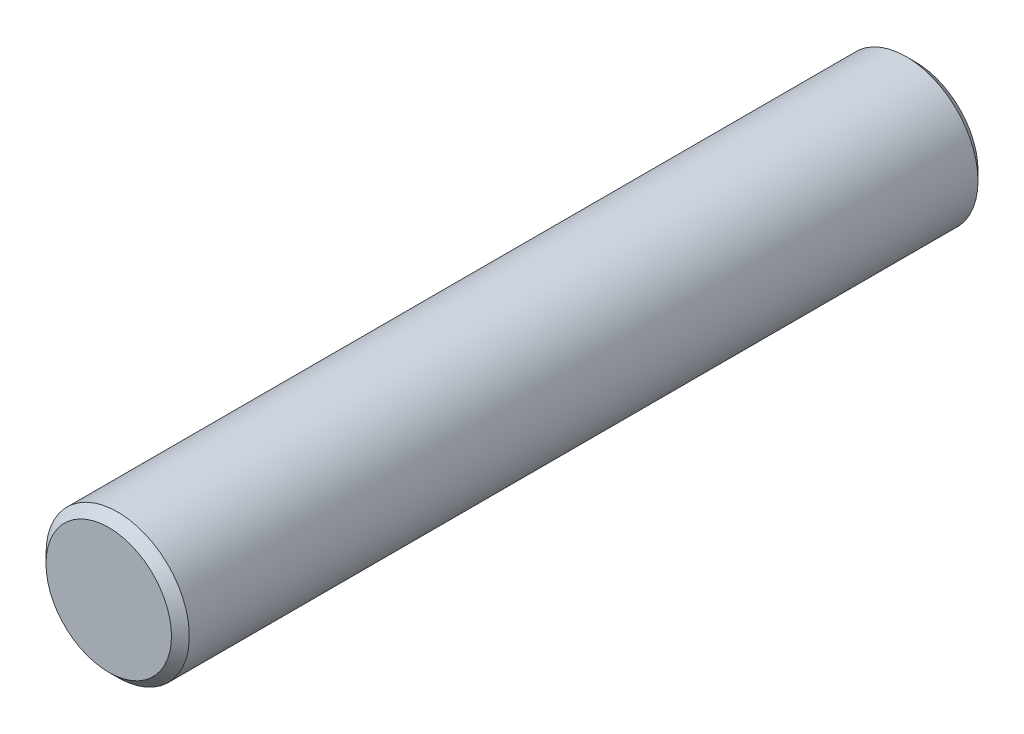
ISO-10303-21;
HEADER;
FILE_DESCRIPTION(('STEP AP214'),'2;1');
FILE_NAME('part.step','',(''),(''),'','','');
FILE_SCHEMA(('AUTOMOTIVE_DESIGN { 1 0 10303 214 1 1 1 1 }'));
ENDSEC;
DATA;
#1=APPLICATION_CONTEXT('core data for automotive mechanical design processes');
#2=APPLICATION_PROTOCOL_DEFINITION('international standard','automotive_design',2000,#1);
#3=PRODUCT_CONTEXT('',#1,'mechanical');
#4=PRODUCT('Part','Part','',(#3));
#5=PRODUCT_RELATED_PRODUCT_CATEGORY('part','',(#4));
#6=PRODUCT_DEFINITION_FORMATION('','',#4);
#7=PRODUCT_DEFINITION_CONTEXT('part definition',#1,'design');
#8=PRODUCT_DEFINITION('design','',#6,#7);
#9=PRODUCT_DEFINITION_SHAPE('','',#8);
#10=(LENGTH_UNIT() NAMED_UNIT(*) SI_UNIT(.MILLI.,.METRE.));
#11=(NAMED_UNIT(*) PLANE_ANGLE_UNIT() SI_UNIT($,.RADIAN.));
#12=(NAMED_UNIT(*) SI_UNIT($,.STERADIAN.) SOLID_ANGLE_UNIT());
#13=UNCERTAINTY_MEASURE_WITH_UNIT(LENGTH_MEASURE(1.E-05),#10,'distance_accuracy_value','');
#14=(GEOMETRIC_REPRESENTATION_CONTEXT(3) GLOBAL_UNCERTAINTY_ASSIGNED_CONTEXT((#13)) GLOBAL_UNIT_ASSIGNED_CONTEXT((#10,
#11,#12)) REPRESENTATION_CONTEXT('',''));
#15=CARTESIAN_POINT('',(0.,0.,0.));
#16=DIRECTION('',(0.,0.,1.));
#17=DIRECTION('',(1.,0.,0.));
#18=AXIS2_PLACEMENT_3D('',#15,#16,#17);
#19=CARTESIAN_POINT('',(0.,0.,45.));
#20=DIRECTION('',(0.,0.,-1.));
#21=DIRECTION('',(-1.,0.,0.));
#22=AXIS2_PLACEMENT_3D('',#19,#20,#21);
#23=CYLINDRICAL_SURFACE('',#22,4.);
#24=CARTESIAN_POINT('',(0.,0.,0.500000000000035));
#25=DIRECTION('',(0.,0.,1.));
#26=DIRECTION('',(1.,0.,0.));
#27=AXIS2_PLACEMENT_3D('',#24,#25,#26);
#28=CIRCLE('',#27,4.);
#29=CARTESIAN_POINT('',(-4.,0.,0.500000000000035));
#30=VERTEX_POINT('',#29);
#31=EDGE_CURVE('E45',#30,#30,#28,.T.);
#32=CARTESIAN_POINT('',(0.,0.,44.5));
#33=DIRECTION('',(0.,0.,1.));
#34=DIRECTION('',(1.,0.,0.));
#35=AXIS2_PLACEMENT_3D('',#32,#33,#34);
#36=CIRCLE('',#35,4.);
#37=CARTESIAN_POINT('',(-4.,0.,44.5));
#38=VERTEX_POINT('',#37);
#39=EDGE_CURVE('E49',#38,#38,#36,.F.);
#40=CARTESIAN_POINT('',(-4.,0.,0.500000000000035));
#41=CARTESIAN_POINT('',(-4.,0.,0.958333333333369));
#42=CARTESIAN_POINT('',(-4.,0.,1.4166666666667));
#43=CARTESIAN_POINT('',(-4.,0.,2.33333333333337));
#44=CARTESIAN_POINT('',(-4.,0.,2.7916666666667));
#45=CARTESIAN_POINT('',(-4.,0.,3.70833333333336));
#46=CARTESIAN_POINT('',(-4.,0.,4.1666666666667));
#47=CARTESIAN_POINT('',(-4.,0.,5.08333333333337));
#48=CARTESIAN_POINT('',(-4.,0.,5.5416666666667));
#49=CARTESIAN_POINT('',(-4.,0.,6.45833333333337));
#50=CARTESIAN_POINT('',(-4.,0.,6.9166666666667));
#51=CARTESIAN_POINT('',(-4.,0.,7.83333333333337));
#52=CARTESIAN_POINT('',(-4.,0.,8.2916666666667));
#53=CARTESIAN_POINT('',(-4.,0.,9.20833333333336));
#54=CARTESIAN_POINT('',(-4.,0.,9.6666666666667));
#55=CARTESIAN_POINT('',(-4.,0.,10.5833333333334));
#56=CARTESIAN_POINT('',(-4.,0.,11.0416666666667));
#57=CARTESIAN_POINT('',(-4.,0.,11.9583333333334));
#58=CARTESIAN_POINT('',(-4.,0.,12.4166666666667));
#59=CARTESIAN_POINT('',(-4.,0.,13.3333333333334));
#60=CARTESIAN_POINT('',(-4.,0.,13.7916666666667));
#61=CARTESIAN_POINT('',(-4.,0.,14.7083333333334));
#62=CARTESIAN_POINT('',(-4.,0.,15.1666666666667));
#63=CARTESIAN_POINT('',(-4.,0.,16.0833333333334));
#64=CARTESIAN_POINT('',(-4.,0.,16.5416666666667));
#65=CARTESIAN_POINT('',(-4.,0.,17.4583333333334));
#66=CARTESIAN_POINT('',(-4.,0.,17.9166666666667));
#67=CARTESIAN_POINT('',(-4.,0.,18.8333333333334));
#68=CARTESIAN_POINT('',(-4.,0.,19.2916666666667));
#69=CARTESIAN_POINT('',(-4.,0.,20.2083333333334));
#70=CARTESIAN_POINT('',(-4.,0.,20.6666666666667));
#71=CARTESIAN_POINT('',(-4.,0.,21.5833333333334));
#72=CARTESIAN_POINT('',(-4.,0.,22.0416666666667));
#73=CARTESIAN_POINT('',(-4.,0.,22.9583333333333));
#74=CARTESIAN_POINT('',(-4.,0.,23.4166666666667));
#75=CARTESIAN_POINT('',(-4.,0.,24.3333333333334));
#76=CARTESIAN_POINT('',(-4.,0.,24.7916666666667));
#77=CARTESIAN_POINT('',(-4.,0.,25.7083333333333));
#78=CARTESIAN_POINT('',(-4.,0.,26.1666666666667));
#79=CARTESIAN_POINT('',(-4.,0.,27.0833333333333));
#80=CARTESIAN_POINT('',(-4.,0.,27.5416666666667));
#81=CARTESIAN_POINT('',(-4.,0.,28.4583333333333));
#82=CARTESIAN_POINT('',(-4.,0.,28.9166666666667));
#83=CARTESIAN_POINT('',(-4.,0.,29.8333333333333));
#84=CARTESIAN_POINT('',(-4.,0.,30.2916666666667));
#85=CARTESIAN_POINT('',(-4.,0.,31.2083333333333));
#86=CARTESIAN_POINT('',(-4.,0.,31.6666666666667));
#87=CARTESIAN_POINT('',(-4.,0.,32.5833333333333));
#88=CARTESIAN_POINT('',(-4.,0.,33.0416666666667));
#89=CARTESIAN_POINT('',(-4.,0.,33.9583333333333));
#90=CARTESIAN_POINT('',(-4.,0.,34.4166666666667));
#91=CARTESIAN_POINT('',(-4.,0.,35.3333333333333));
#92=CARTESIAN_POINT('',(-4.,0.,35.7916666666667));
#93=CARTESIAN_POINT('',(-4.,0.,36.7083333333333));
#94=CARTESIAN_POINT('',(-4.,0.,37.1666666666667));
#95=CARTESIAN_POINT('',(-4.,0.,38.0833333333333));
#96=CARTESIAN_POINT('',(-4.,0.,38.5416666666667));
#97=CARTESIAN_POINT('',(-4.,0.,39.4583333333333));
#98=CARTESIAN_POINT('',(-4.,0.,39.9166666666667));
#99=CARTESIAN_POINT('',(-4.,0.,40.8333333333333));
#100=CARTESIAN_POINT('',(-4.,0.,41.2916666666667));
#101=CARTESIAN_POINT('',(-4.,0.,42.2083333333333));
#102=CARTESIAN_POINT('',(-4.,0.,42.6666666666667));
#103=CARTESIAN_POINT('',(-4.,0.,43.5833333333333));
#104=CARTESIAN_POINT('',(-4.,0.,44.0416666666667));
#105=CARTESIAN_POINT('',(-4.,0.,44.5));
#106=B_SPLINE_CURVE_WITH_KNOTS('',3,(#40,#41,#42,#43,#44,#45,#46,#47,#48,#49,#50,#51,#52,#53,
#54,#55,#56,#57,#58,#59,#60,#61,#62,#63,#64,#65,#66,#67,#68,#69,#70,#71,#72,#73,#74,#75,#76,#77,
#78,#79,#80,#81,#82,#83,#84,#85,#86,#87,#88,#89,#90,#91,#92,#93,#94,#95,#96,#97,#98,#99,#100,
#101,#102,#103,#104,#105),.UNSPECIFIED.,.F.,.F.,(4,2,2,2,2,2,2,2,2,2,2,2,2,2,2,2,2,2,2,2,2,2,2,
2,2,2,2,2,2,2,2,2,4),(0.,1.375,2.75,4.125,5.5,6.875,8.24999999999999,9.62499999999999,11.,
12.375,13.75,15.125,16.5,17.875,19.25,20.625,22.,23.375,24.75,26.125,27.5,28.875,30.25,31.625,
33.,34.375,35.75,37.125,38.5,39.875,41.25,42.625,44.),.UNSPECIFIED.);
#107=EDGE_CURVE('BSEAM34',#30,#38,#106,.T.);
#108=ORIENTED_EDGE('',*,*,#31,.T.);
#109=ORIENTED_EDGE('',*,*,#39,.T.);
#110=ORIENTED_EDGE('',*,*,#107,.T.);
#111=ORIENTED_EDGE('',*,*,#107,.F.);
#112=EDGE_LOOP('',(#108,#110,#109,#111));
#113=FACE_BOUND('',#112,.T.);
#114=ADVANCED_FACE('F34',(#113),#23,.T.);
#115=CARTESIAN_POINT('',(0.,0.,45.));
#116=DIRECTION('',(0.,0.,1.));
#117=DIRECTION('',(1.,0.,0.));
#118=AXIS2_PLACEMENT_3D('',#115,#116,#117);
#119=PLANE('',#118);
#120=CARTESIAN_POINT('',(0.,0.,45.));
#121=DIRECTION('',(0.,0.,1.));
#122=DIRECTION('',(1.,0.,0.));
#123=AXIS2_PLACEMENT_3D('',#120,#121,#122);
#124=CIRCLE('',#123,3.50000000000002);
#125=CARTESIAN_POINT('',(3.50000000000002,0.,45.));
#126=VERTEX_POINT('',#125);
#127=EDGE_CURVE('E10',#126,#126,#124,.T.);
#128=ORIENTED_EDGE('',*,*,#127,.T.);
#129=EDGE_LOOP('',(#128));
#130=FACE_BOUND('',#129,.T.);
#131=ADVANCED_FACE('F65',(#130),#119,.T.);
#132=CARTESIAN_POINT('',(0.,0.,0.));
#133=DIRECTION('',(0.,0.,1.));
#134=DIRECTION('',(1.,0.,0.));
#135=AXIS2_PLACEMENT_3D('',#132,#133,#134);
#136=PLANE('',#135);
#137=CARTESIAN_POINT('',(0.,0.,0.));
#138=DIRECTION('',(0.,0.,1.));
#139=DIRECTION('',(1.,0.,0.));
#140=AXIS2_PLACEMENT_3D('',#137,#138,#139);
#141=CIRCLE('',#140,3.49999999999996);
#142=CARTESIAN_POINT('',(3.49999999999996,0.,0.));
#143=VERTEX_POINT('',#142);
#144=EDGE_CURVE('E41',#143,#143,#141,.F.);
#145=ORIENTED_EDGE('',*,*,#144,.T.);
#146=EDGE_LOOP('',(#145));
#147=FACE_BOUND('',#146,.T.);
#148=ADVANCED_FACE('F62',(#147),#136,.F.);
#149=CARTESIAN_POINT('',(0.,0.,0.500000000000035));
#150=DIRECTION('',(0.,0.,1.));
#151=DIRECTION('',(1.,0.,0.));
#152=AXIS2_PLACEMENT_3D('',#149,#150,#151);
#153=CONICAL_SURFACE('',#152,4.,0.785398163397456);
#154=ORIENTED_EDGE('',*,*,#144,.F.);
#155=EDGE_LOOP('',(#154));
#156=FACE_BOUND('',#155,.T.);
#157=ORIENTED_EDGE('',*,*,#31,.F.);
#158=EDGE_LOOP('',(#157));
#159=FACE_BOUND('',#158,.T.);
#160=ADVANCED_FACE('F58',(#156,#159),#153,.T.);
#161=CARTESIAN_POINT('',(0.,0.,45.));
#162=DIRECTION('',(0.,0.,-1.));
#163=DIRECTION('',(-1.,0.,0.));
#164=AXIS2_PLACEMENT_3D('',#161,#162,#163);
#165=CONICAL_SURFACE('',#164,3.50000000000002,0.785398163397446);
#166=ORIENTED_EDGE('',*,*,#39,.F.);
#167=EDGE_LOOP('',(#166));
#168=FACE_BOUND('',#167,.T.);
#169=ORIENTED_EDGE('',*,*,#127,.F.);
#170=EDGE_LOOP('',(#169));
#171=FACE_BOUND('',#170,.T.);
#172=ADVANCED_FACE('F36',(#168,#171),#165,.T.);
#173=CLOSED_SHELL('',(#114,#131,#148,#160,#172));
#174=MANIFOLD_SOLID_BREP('B2',#173);
#175=ADVANCED_BREP_SHAPE_REPRESENTATION('',(#18,#174),#14);
#176=SHAPE_DEFINITION_REPRESENTATION(#9,#175);
ENDSEC;
END-ISO-10303-21;
